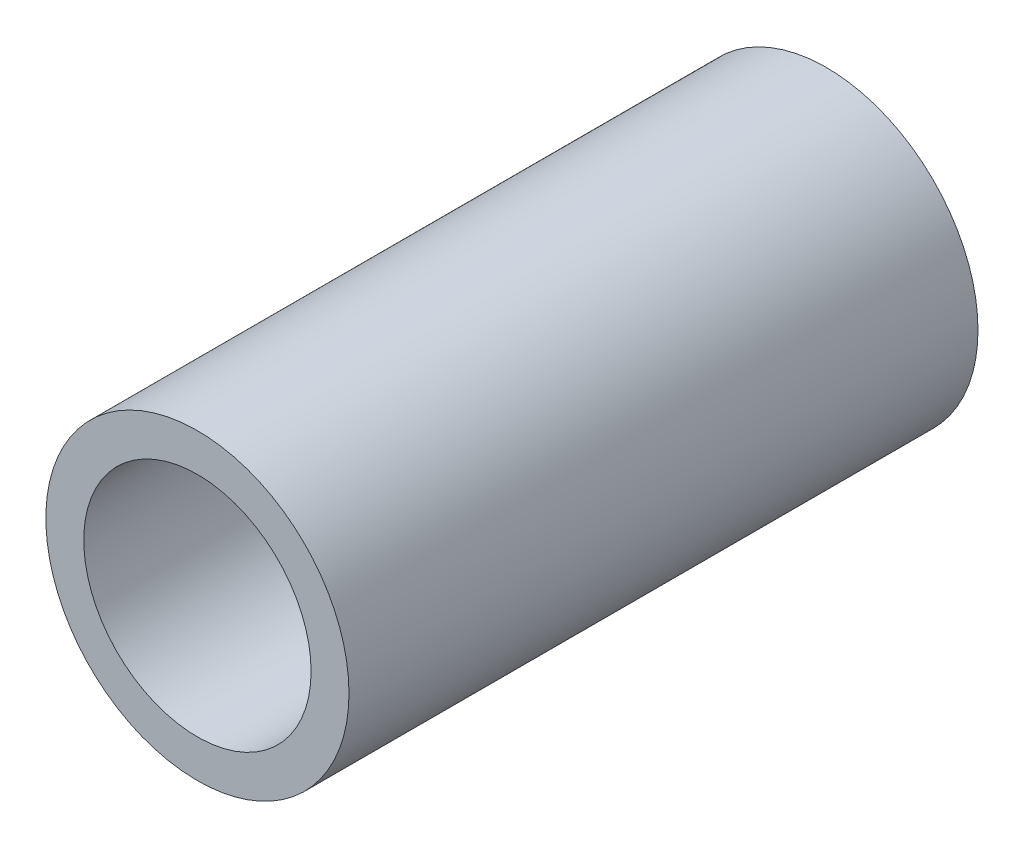
ISO-10303-21;
HEADER;
FILE_DESCRIPTION(('STEP AP214'),'2;1');
FILE_NAME('part.step','',(''),(''),'','','');
FILE_SCHEMA(('AUTOMOTIVE_DESIGN { 1 0 10303 214 1 1 1 1 }'));
ENDSEC;
DATA;
#1=APPLICATION_CONTEXT('core data for automotive mechanical design processes');
#2=APPLICATION_PROTOCOL_DEFINITION('international standard','automotive_design',2000,#1);
#3=PRODUCT_CONTEXT('',#1,'mechanical');
#4=PRODUCT('Part','Part','',(#3));
#5=PRODUCT_RELATED_PRODUCT_CATEGORY('part','',(#4));
#6=PRODUCT_DEFINITION_FORMATION('','',#4);
#7=PRODUCT_DEFINITION_CONTEXT('part definition',#1,'design');
#8=PRODUCT_DEFINITION('design','',#6,#7);
#9=PRODUCT_DEFINITION_SHAPE('','',#8);
#10=(LENGTH_UNIT() NAMED_UNIT(*) SI_UNIT(.MILLI.,.METRE.));
#11=(NAMED_UNIT(*) PLANE_ANGLE_UNIT() SI_UNIT($,.RADIAN.));
#12=(NAMED_UNIT(*) SI_UNIT($,.STERADIAN.) SOLID_ANGLE_UNIT());
#13=UNCERTAINTY_MEASURE_WITH_UNIT(LENGTH_MEASURE(1.E-05),#10,'distance_accuracy_value','');
#14=(GEOMETRIC_REPRESENTATION_CONTEXT(3) GLOBAL_UNCERTAINTY_ASSIGNED_CONTEXT((#13)) GLOBAL_UNIT_ASSIGNED_CONTEXT((#10,
#11,#12)) REPRESENTATION_CONTEXT('',''));
#15=CARTESIAN_POINT('',(0.,0.,0.));
#16=DIRECTION('',(0.,0.,1.));
#17=DIRECTION('',(1.,0.,0.));
#18=AXIS2_PLACEMENT_3D('',#15,#16,#17);
#19=CARTESIAN_POINT('',(0.,0.,83.));
#20=DIRECTION('',(0.,0.,1.));
#21=DIRECTION('',(1.,0.,0.));
#22=AXIS2_PLACEMENT_3D('',#19,#20,#21);
#23=PLANE('',#22);
#24=CARTESIAN_POINT('',(0.,0.,83.));
#25=DIRECTION('',(0.,0.,1.));
#26=DIRECTION('',(1.,0.,0.));
#27=AXIS2_PLACEMENT_3D('',#24,#25,#26);
#28=CIRCLE('',#27,20.);
#29=CARTESIAN_POINT('',(20.,0.,83.));
#30=VERTEX_POINT('',#29);
#31=EDGE_CURVE('E10',#30,#30,#28,.T.);
#32=ORIENTED_EDGE('',*,*,#31,.T.);
#33=EDGE_LOOP('',(#32));
#34=FACE_BOUND('',#33,.T.);
#35=CARTESIAN_POINT('',(0.,0.,83.));
#36=DIRECTION('',(0.,0.,1.));
#37=DIRECTION('',(1.,0.,0.));
#38=AXIS2_PLACEMENT_3D('',#35,#36,#37);
#39=CIRCLE('',#38,15.);
#40=CARTESIAN_POINT('',(15.,0.,83.));
#41=VERTEX_POINT('',#40);
#42=EDGE_CURVE('E42',#41,#41,#39,.T.);
#43=ORIENTED_EDGE('',*,*,#42,.F.);
#44=EDGE_LOOP('',(#43));
#45=FACE_BOUND('',#44,.T.);
#46=ADVANCED_FACE('F31',(#34,#45),#23,.T.);
#47=CARTESIAN_POINT('',(0.,0.,0.));
#48=DIRECTION('',(0.,0.,1.));
#49=DIRECTION('',(1.,0.,0.));
#50=AXIS2_PLACEMENT_3D('',#47,#48,#49);
#51=PLANE('',#50);
#52=CARTESIAN_POINT('',(0.,0.,0.));
#53=DIRECTION('',(0.,0.,1.));
#54=DIRECTION('',(1.,0.,0.));
#55=AXIS2_PLACEMENT_3D('',#52,#53,#54);
#56=CIRCLE('',#55,20.);
#57=CARTESIAN_POINT('',(20.,0.,0.));
#58=VERTEX_POINT('',#57);
#59=EDGE_CURVE('E35',#58,#58,#56,.T.);
#60=ORIENTED_EDGE('',*,*,#59,.F.);
#61=EDGE_LOOP('',(#60));
#62=FACE_BOUND('',#61,.T.);
#63=CARTESIAN_POINT('',(0.,0.,0.));
#64=DIRECTION('',(0.,0.,1.));
#65=DIRECTION('',(1.,0.,0.));
#66=AXIS2_PLACEMENT_3D('',#63,#64,#65);
#67=CIRCLE('',#66,15.);
#68=CARTESIAN_POINT('',(15.,0.,0.));
#69=VERTEX_POINT('',#68);
#70=EDGE_CURVE('E44',#69,#69,#67,.T.);
#71=ORIENTED_EDGE('',*,*,#70,.T.);
#72=EDGE_LOOP('',(#71));
#73=FACE_BOUND('',#72,.T.);
#74=ADVANCED_FACE('F54',(#62,#73),#51,.F.);
#75=CARTESIAN_POINT('',(0.,0.,83.));
#76=DIRECTION('',(0.,0.,-1.));
#77=DIRECTION('',(-1.,0.,0.));
#78=AXIS2_PLACEMENT_3D('',#75,#76,#77);
#79=CYLINDRICAL_SURFACE('',#78,20.);
#80=ORIENTED_EDGE('',*,*,#31,.F.);
#81=EDGE_LOOP('',(#80));
#82=FACE_BOUND('',#81,.T.);
#83=ORIENTED_EDGE('',*,*,#59,.T.);
#84=EDGE_LOOP('',(#83));
#85=FACE_BOUND('',#84,.T.);
#86=ADVANCED_FACE('F33',(#82,#85),#79,.T.);
#87=CARTESIAN_POINT('',(0.,0.,83.));
#88=DIRECTION('',(0.,0.,-1.));
#89=DIRECTION('',(-1.,0.,0.));
#90=AXIS2_PLACEMENT_3D('',#87,#88,#89);
#91=CYLINDRICAL_SURFACE('',#90,15.);
#92=ORIENTED_EDGE('',*,*,#42,.T.);
#93=EDGE_LOOP('',(#92));
#94=FACE_BOUND('',#93,.T.);
#95=ORIENTED_EDGE('',*,*,#70,.F.);
#96=EDGE_LOOP('',(#95));
#97=FACE_BOUND('',#96,.T.);
#98=ADVANCED_FACE('F50',(#94,#97),#91,.F.);
#99=CLOSED_SHELL('',(#46,#74,#86,#98));
#100=MANIFOLD_SOLID_BREP('B2',#99);
#101=ADVANCED_BREP_SHAPE_REPRESENTATION('',(#18,#100),#14);
#102=SHAPE_DEFINITION_REPRESENTATION(#9,#101);
ENDSEC;
END-ISO-10303-21;
